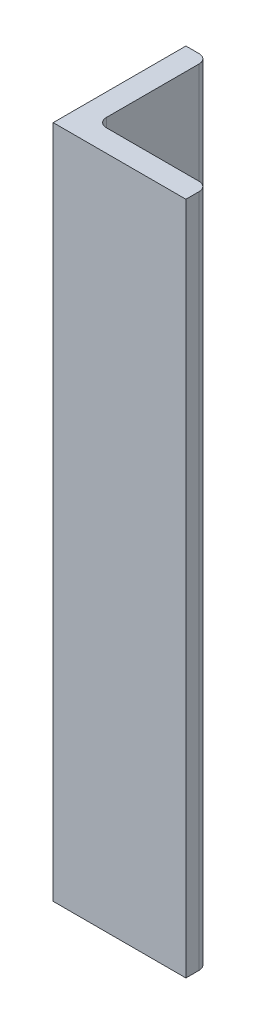
ISO-10303-21;
HEADER;
FILE_DESCRIPTION(('STEP AP214'),'2;1');
FILE_NAME('part.step','',(''),(''),'','','');
FILE_SCHEMA(('AUTOMOTIVE_DESIGN { 1 0 10303 214 1 1 1 1 }'));
ENDSEC;
DATA;
#1=APPLICATION_CONTEXT('core data for automotive mechanical design processes');
#2=APPLICATION_PROTOCOL_DEFINITION('international standard','automotive_design',2000,#1);
#3=PRODUCT_CONTEXT('',#1,'mechanical');
#4=PRODUCT('Part','Part','',(#3));
#5=PRODUCT_RELATED_PRODUCT_CATEGORY('part','',(#4));
#6=PRODUCT_DEFINITION_FORMATION('','',#4);
#7=PRODUCT_DEFINITION_CONTEXT('part definition',#1,'design');
#8=PRODUCT_DEFINITION('design','',#6,#7);
#9=PRODUCT_DEFINITION_SHAPE('','',#8);
#10=(LENGTH_UNIT() NAMED_UNIT(*) SI_UNIT(.MILLI.,.METRE.));
#11=(NAMED_UNIT(*) PLANE_ANGLE_UNIT() SI_UNIT($,.RADIAN.));
#12=(NAMED_UNIT(*) SI_UNIT($,.STERADIAN.) SOLID_ANGLE_UNIT());
#13=UNCERTAINTY_MEASURE_WITH_UNIT(LENGTH_MEASURE(1.E-05),#10,'distance_accuracy_value','');
#14=(GEOMETRIC_REPRESENTATION_CONTEXT(3) GLOBAL_UNCERTAINTY_ASSIGNED_CONTEXT((#13)) GLOBAL_UNIT_ASSIGNED_CONTEXT((#10,
#11,#12)) REPRESENTATION_CONTEXT('',''));
#15=CARTESIAN_POINT('',(0.,0.,0.));
#16=DIRECTION('',(0.,0.,1.));
#17=DIRECTION('',(1.,0.,0.));
#18=AXIS2_PLACEMENT_3D('',#15,#16,#17);
#19=CARTESIAN_POINT('',(19.05,96.8248,0.));
#20=DIRECTION('',(0.,0.,-1.));
#21=DIRECTION('',(-1.,0.,0.));
#22=AXIS2_PLACEMENT_3D('',#19,#20,#21);
#23=PLANE('',#22);
#24=DIRECTION('',(1.,0.,0.));
#25=VECTOR('',#24,1.);
#26=CARTESIAN_POINT('',(19.05,0.,0.));
#27=LINE('',#26,#25);
#28=CARTESIAN_POINT('',(0.,0.,0.));
#29=VERTEX_POINT('',#28);
#30=CARTESIAN_POINT('',(19.05,0.,0.));
#31=VERTEX_POINT('',#30);
#32=EDGE_CURVE('E137',#29,#31,#27,.T.);
#33=ORIENTED_EDGE('',*,*,#32,.T.);
#34=DIRECTION('',(0.,-1.,0.));
#35=VECTOR('',#34,1.);
#36=CARTESIAN_POINT('',(19.05,96.8248,0.));
#37=LINE('',#36,#35);
#38=CARTESIAN_POINT('',(19.05,96.8248,0.));
#39=VERTEX_POINT('',#38);
#40=EDGE_CURVE('E11',#39,#31,#37,.T.);
#41=ORIENTED_EDGE('',*,*,#40,.F.);
#42=DIRECTION('',(1.,0.,0.));
#43=VECTOR('',#42,1.);
#44=CARTESIAN_POINT('',(19.05,96.8248,0.));
#45=LINE('',#44,#43);
#46=CARTESIAN_POINT('',(0.,96.8248,0.));
#47=VERTEX_POINT('',#46);
#48=EDGE_CURVE('E153',#47,#39,#45,.T.);
#49=ORIENTED_EDGE('',*,*,#48,.F.);
#50=DIRECTION('',(0.,-1.,0.));
#51=VECTOR('',#50,1.);
#52=CARTESIAN_POINT('',(0.,96.8248,0.));
#53=LINE('',#52,#51);
#54=EDGE_CURVE('E133',#47,#29,#53,.T.);
#55=ORIENTED_EDGE('',*,*,#54,.T.);
#56=EDGE_LOOP('',(#33,#41,#49,#55));
#57=FACE_BOUND('',#56,.T.);
#58=ADVANCED_FACE('F35',(#57),#23,.F.);
#59=CARTESIAN_POINT('',(19.05,96.8248,-1.905));
#60=DIRECTION('',(-1.,0.,0.));
#61=DIRECTION('',(0.,0.,1.));
#62=AXIS2_PLACEMENT_3D('',#59,#60,#61);
#63=PLANE('',#62);
#64=DIRECTION('',(0.,0.,-1.));
#65=VECTOR('',#64,1.);
#66=CARTESIAN_POINT('',(19.05,0.,-1.905));
#67=LINE('',#66,#65);
#68=CARTESIAN_POINT('',(19.05,0.,-1.905));
#69=VERTEX_POINT('',#68);
#70=EDGE_CURVE('E140',#31,#69,#67,.T.);
#71=ORIENTED_EDGE('',*,*,#70,.T.);
#72=DIRECTION('',(0.,-1.,0.));
#73=VECTOR('',#72,1.);
#74=CARTESIAN_POINT('',(19.05,96.8248,-1.905));
#75=LINE('',#74,#73);
#76=CARTESIAN_POINT('',(19.05,96.8248,-1.905));
#77=VERTEX_POINT('',#76);
#78=EDGE_CURVE('E43',#77,#69,#75,.T.);
#79=ORIENTED_EDGE('',*,*,#78,.F.);
#80=DIRECTION('',(0.,0.,-1.));
#81=VECTOR('',#80,1.);
#82=CARTESIAN_POINT('',(19.05,96.8248,-1.905));
#83=LINE('',#82,#81);
#84=EDGE_CURVE('E97',#39,#77,#83,.T.);
#85=ORIENTED_EDGE('',*,*,#84,.F.);
#86=ORIENTED_EDGE('',*,*,#40,.T.);
#87=EDGE_LOOP('',(#71,#79,#85,#86));
#88=FACE_BOUND('',#87,.T.);
#89=ADVANCED_FACE('F196',(#88),#63,.F.);
#90=CARTESIAN_POINT('',(17.78,96.8248,-1.905));
#91=DIRECTION('',(0.,-1.,0.));
#92=DIRECTION('',(0.,0.,-1.));
#93=AXIS2_PLACEMENT_3D('',#90,#91,#92);
#94=CYLINDRICAL_SURFACE('',#93,1.27);
#95=CARTESIAN_POINT('',(17.78,0.,-1.905));
#96=DIRECTION('',(0.,1.,0.));
#97=DIRECTION('',(0.,0.,-1.));
#98=AXIS2_PLACEMENT_3D('',#95,#96,#97);
#99=CIRCLE('',#98,1.27);
#100=CARTESIAN_POINT('',(17.78,0.,-3.175));
#101=VERTEX_POINT('',#100);
#102=EDGE_CURVE('E142',#69,#101,#99,.T.);
#103=ORIENTED_EDGE('',*,*,#102,.T.);
#104=DIRECTION('',(0.,-1.,0.));
#105=VECTOR('',#104,1.);
#106=CARTESIAN_POINT('',(17.78,96.8248,-3.175));
#107=LINE('',#106,#105);
#108=CARTESIAN_POINT('',(17.78,96.8248,-3.175));
#109=VERTEX_POINT('',#108);
#110=EDGE_CURVE('E163',#109,#101,#107,.T.);
#111=ORIENTED_EDGE('',*,*,#110,.F.);
#112=CARTESIAN_POINT('',(17.78,96.8248,-1.905));
#113=DIRECTION('',(0.,1.,0.));
#114=DIRECTION('',(0.,0.,-1.));
#115=AXIS2_PLACEMENT_3D('',#112,#113,#114);
#116=CIRCLE('',#115,1.27);
#117=EDGE_CURVE('E171',#77,#109,#116,.T.);
#118=ORIENTED_EDGE('',*,*,#117,.F.);
#119=ORIENTED_EDGE('',*,*,#78,.T.);
#120=EDGE_LOOP('',(#103,#111,#118,#119));
#121=FACE_BOUND('',#120,.T.);
#122=ADVANCED_FACE('F169',(#121),#94,.T.);
#123=CARTESIAN_POINT('',(4.445,96.8248,-3.175));
#124=DIRECTION('',(0.,0.,1.));
#125=DIRECTION('',(1.,0.,0.));
#126=AXIS2_PLACEMENT_3D('',#123,#124,#125);
#127=PLANE('',#126);
#128=DIRECTION('',(-1.,0.,0.));
#129=VECTOR('',#128,1.);
#130=CARTESIAN_POINT('',(4.445,0.,-3.175));
#131=LINE('',#130,#129);
#132=CARTESIAN_POINT('',(4.445,0.,-3.175));
#133=VERTEX_POINT('',#132);
#134=EDGE_CURVE('E144',#101,#133,#131,.T.);
#135=ORIENTED_EDGE('',*,*,#134,.T.);
#136=DIRECTION('',(0.,-1.,0.));
#137=VECTOR('',#136,1.);
#138=CARTESIAN_POINT('',(4.445,96.8248,-3.175));
#139=LINE('',#138,#137);
#140=CARTESIAN_POINT('',(4.445,96.8248,-3.175));
#141=VERTEX_POINT('',#140);
#142=EDGE_CURVE('E160',#141,#133,#139,.T.);
#143=ORIENTED_EDGE('',*,*,#142,.F.);
#144=DIRECTION('',(-1.,0.,0.));
#145=VECTOR('',#144,1.);
#146=CARTESIAN_POINT('',(4.445,96.8248,-3.175));
#147=LINE('',#146,#145);
#148=EDGE_CURVE('E187',#109,#141,#147,.T.);
#149=ORIENTED_EDGE('',*,*,#148,.F.);
#150=ORIENTED_EDGE('',*,*,#110,.T.);
#151=EDGE_LOOP('',(#135,#143,#149,#150));
#152=FACE_BOUND('',#151,.T.);
#153=ADVANCED_FACE('F180',(#152),#127,.F.);
#154=CARTESIAN_POINT('',(4.445,96.8248,-4.445));
#155=DIRECTION('',(0.,-1.,0.));
#156=DIRECTION('',(0.,0.,-1.));
#157=AXIS2_PLACEMENT_3D('',#154,#155,#156);
#158=CYLINDRICAL_SURFACE('',#157,1.27);
#159=CARTESIAN_POINT('',(4.445,0.,-4.445));
#160=DIRECTION('',(0.,-1.,0.));
#161=DIRECTION('',(0.,0.,1.));
#162=AXIS2_PLACEMENT_3D('',#159,#160,#161);
#163=CIRCLE('',#162,1.27);
#164=CARTESIAN_POINT('',(3.175,0.,-4.445));
#165=VERTEX_POINT('',#164);
#166=EDGE_CURVE('E146',#133,#165,#163,.T.);
#167=ORIENTED_EDGE('',*,*,#166,.T.);
#168=DIRECTION('',(0.,-1.,0.));
#169=VECTOR('',#168,1.);
#170=CARTESIAN_POINT('',(3.175,96.8248,-4.445));
#171=LINE('',#170,#169);
#172=CARTESIAN_POINT('',(3.175,96.8248,-4.445));
#173=VERTEX_POINT('',#172);
#174=EDGE_CURVE('E157',#173,#165,#171,.T.);
#175=ORIENTED_EDGE('',*,*,#174,.F.);
#176=CARTESIAN_POINT('',(4.445,96.8248,-4.445));
#177=DIRECTION('',(0.,-1.,0.));
#178=DIRECTION('',(0.,0.,1.));
#179=AXIS2_PLACEMENT_3D('',#176,#177,#178);
#180=CIRCLE('',#179,1.27);
#181=EDGE_CURVE('E186',#141,#173,#180,.T.);
#182=ORIENTED_EDGE('',*,*,#181,.F.);
#183=ORIENTED_EDGE('',*,*,#142,.T.);
#184=EDGE_LOOP('',(#167,#175,#182,#183));
#185=FACE_BOUND('',#184,.T.);
#186=ADVANCED_FACE('F184',(#185),#158,.F.);
#187=CARTESIAN_POINT('',(3.175,96.8248,-17.78));
#188=DIRECTION('',(-1.,0.,0.));
#189=DIRECTION('',(0.,0.,1.));
#190=AXIS2_PLACEMENT_3D('',#187,#188,#189);
#191=PLANE('',#190);
#192=DIRECTION('',(0.,0.,-1.));
#193=VECTOR('',#192,1.);
#194=CARTESIAN_POINT('',(3.175,0.,-17.78));
#195=LINE('',#194,#193);
#196=CARTESIAN_POINT('',(3.175,0.,-17.78));
#197=VERTEX_POINT('',#196);
#198=EDGE_CURVE('E148',#165,#197,#195,.T.);
#199=ORIENTED_EDGE('',*,*,#198,.T.);
#200=DIRECTION('',(0.,-1.,0.));
#201=VECTOR('',#200,1.);
#202=CARTESIAN_POINT('',(3.175,96.8248,-17.78));
#203=LINE('',#202,#201);
#204=CARTESIAN_POINT('',(3.175,96.8248,-17.78));
#205=VERTEX_POINT('',#204);
#206=EDGE_CURVE('E128',#205,#197,#203,.T.);
#207=ORIENTED_EDGE('',*,*,#206,.F.);
#208=DIRECTION('',(0.,0.,-1.));
#209=VECTOR('',#208,1.);
#210=CARTESIAN_POINT('',(3.175,96.8248,-17.78));
#211=LINE('',#210,#209);
#212=EDGE_CURVE('E119',#173,#205,#211,.T.);
#213=ORIENTED_EDGE('',*,*,#212,.F.);
#214=ORIENTED_EDGE('',*,*,#174,.T.);
#215=EDGE_LOOP('',(#199,#207,#213,#214));
#216=FACE_BOUND('',#215,.T.);
#217=ADVANCED_FACE('F208',(#216),#191,.F.);
#218=CARTESIAN_POINT('',(1.905,96.8248,-17.78));
#219=DIRECTION('',(0.,-1.,0.));
#220=DIRECTION('',(0.,0.,-1.));
#221=AXIS2_PLACEMENT_3D('',#218,#219,#220);
#222=CYLINDRICAL_SURFACE('',#221,1.27);
#223=CARTESIAN_POINT('',(1.905,0.,-17.78));
#224=DIRECTION('',(0.,1.,0.));
#225=DIRECTION('',(0.,0.,-1.));
#226=AXIS2_PLACEMENT_3D('',#223,#224,#225);
#227=CIRCLE('',#226,1.27);
#228=CARTESIAN_POINT('',(1.90499999999999,0.,-19.05));
#229=VERTEX_POINT('',#228);
#230=EDGE_CURVE('E127',#197,#229,#227,.T.);
#231=ORIENTED_EDGE('',*,*,#230,.T.);
#232=DIRECTION('',(0.,-1.,0.));
#233=VECTOR('',#232,1.);
#234=CARTESIAN_POINT('',(1.90499999999999,96.8248,-19.05));
#235=LINE('',#234,#233);
#236=CARTESIAN_POINT('',(1.90499999999999,96.8248,-19.05));
#237=VERTEX_POINT('',#236);
#238=EDGE_CURVE('E124',#237,#229,#235,.T.);
#239=ORIENTED_EDGE('',*,*,#238,.F.);
#240=CARTESIAN_POINT('',(1.905,96.8248,-17.78));
#241=DIRECTION('',(0.,1.,0.));
#242=DIRECTION('',(0.,0.,-1.));
#243=AXIS2_PLACEMENT_3D('',#240,#241,#242);
#244=CIRCLE('',#243,1.27);
#245=EDGE_CURVE('E113',#205,#237,#244,.T.);
#246=ORIENTED_EDGE('',*,*,#245,.F.);
#247=ORIENTED_EDGE('',*,*,#206,.T.);
#248=EDGE_LOOP('',(#231,#239,#246,#247));
#249=FACE_BOUND('',#248,.T.);
#250=ADVANCED_FACE('F125',(#249),#222,.T.);
#251=CARTESIAN_POINT('',(0.,96.8248,-19.05));
#252=DIRECTION('',(0.,0.,1.));
#253=DIRECTION('',(1.,0.,0.));
#254=AXIS2_PLACEMENT_3D('',#251,#252,#253);
#255=PLANE('',#254);
#256=DIRECTION('',(-1.,0.,0.));
#257=VECTOR('',#256,1.);
#258=CARTESIAN_POINT('',(0.,0.,-19.05));
#259=LINE('',#258,#257);
#260=CARTESIAN_POINT('',(0.,0.,-19.05));
#261=VERTEX_POINT('',#260);
#262=EDGE_CURVE('E83',#229,#261,#259,.T.);
#263=ORIENTED_EDGE('',*,*,#262,.T.);
#264=DIRECTION('',(0.,-1.,0.));
#265=VECTOR('',#264,1.);
#266=CARTESIAN_POINT('',(0.,96.8248,-19.05));
#267=LINE('',#266,#265);
#268=CARTESIAN_POINT('',(0.,96.8248,-19.05));
#269=VERTEX_POINT('',#268);
#270=EDGE_CURVE('E129',#269,#261,#267,.T.);
#271=ORIENTED_EDGE('',*,*,#270,.F.);
#272=DIRECTION('',(-1.,0.,0.));
#273=VECTOR('',#272,1.);
#274=CARTESIAN_POINT('',(0.,96.8248,-19.05));
#275=LINE('',#274,#273);
#276=EDGE_CURVE('E117',#237,#269,#275,.T.);
#277=ORIENTED_EDGE('',*,*,#276,.F.);
#278=ORIENTED_EDGE('',*,*,#238,.T.);
#279=EDGE_LOOP('',(#263,#271,#277,#278));
#280=FACE_BOUND('',#279,.T.);
#281=ADVANCED_FACE('F131',(#280),#255,.F.);
#282=CARTESIAN_POINT('',(0.,96.8248,0.));
#283=DIRECTION('',(1.,0.,0.));
#284=DIRECTION('',(0.,0.,-1.));
#285=AXIS2_PLACEMENT_3D('',#282,#283,#284);
#286=PLANE('',#285);
#287=DIRECTION('',(0.,0.,1.));
#288=VECTOR('',#287,1.);
#289=CARTESIAN_POINT('',(0.,0.,0.));
#290=LINE('',#289,#288);
#291=EDGE_CURVE('E89',#261,#29,#290,.T.);
#292=ORIENTED_EDGE('',*,*,#291,.T.);
#293=ORIENTED_EDGE('',*,*,#54,.F.);
#294=DIRECTION('',(0.,0.,1.));
#295=VECTOR('',#294,1.);
#296=CARTESIAN_POINT('',(0.,96.8248,0.));
#297=LINE('',#296,#295);
#298=EDGE_CURVE('E51',#269,#47,#297,.T.);
#299=ORIENTED_EDGE('',*,*,#298,.F.);
#300=ORIENTED_EDGE('',*,*,#270,.T.);
#301=EDGE_LOOP('',(#292,#293,#299,#300));
#302=FACE_BOUND('',#301,.T.);
#303=ADVANCED_FACE('F216',(#302),#286,.F.);
#304=CARTESIAN_POINT('',(1.905,96.8248,-17.78));
#305=DIRECTION('',(0.,-1.,0.));
#306=DIRECTION('',(0.,0.,-1.));
#307=AXIS2_PLACEMENT_3D('',#304,#305,#306);
#308=PLANE('',#307);
#309=ORIENTED_EDGE('',*,*,#48,.T.);
#310=ORIENTED_EDGE('',*,*,#84,.T.);
#311=ORIENTED_EDGE('',*,*,#117,.T.);
#312=ORIENTED_EDGE('',*,*,#148,.T.);
#313=ORIENTED_EDGE('',*,*,#181,.T.);
#314=ORIENTED_EDGE('',*,*,#212,.T.);
#315=ORIENTED_EDGE('',*,*,#245,.T.);
#316=ORIENTED_EDGE('',*,*,#276,.T.);
#317=ORIENTED_EDGE('',*,*,#298,.T.);
#318=EDGE_LOOP('',(#309,#310,#311,#312,#313,#314,#315,#316,#317));
#319=FACE_BOUND('',#318,.T.);
#320=ADVANCED_FACE('F115',(#319),#308,.F.);
#321=CARTESIAN_POINT('',(1.905,0.,-17.78));
#322=DIRECTION('',(0.,-1.,0.));
#323=DIRECTION('',(0.,0.,-1.));
#324=AXIS2_PLACEMENT_3D('',#321,#322,#323);
#325=PLANE('',#324);
#326=ORIENTED_EDGE('',*,*,#32,.F.);
#327=ORIENTED_EDGE('',*,*,#291,.F.);
#328=ORIENTED_EDGE('',*,*,#262,.F.);
#329=ORIENTED_EDGE('',*,*,#230,.F.);
#330=ORIENTED_EDGE('',*,*,#198,.F.);
#331=ORIENTED_EDGE('',*,*,#166,.F.);
#332=ORIENTED_EDGE('',*,*,#134,.F.);
#333=ORIENTED_EDGE('',*,*,#102,.F.);
#334=ORIENTED_EDGE('',*,*,#70,.F.);
#335=EDGE_LOOP('',(#326,#327,#328,#329,#330,#331,#332,#333,#334));
#336=FACE_BOUND('',#335,.T.);
#337=ADVANCED_FACE('F175',(#336),#325,.T.);
#338=CLOSED_SHELL('',(#58,#89,#122,#153,#186,#217,#250,#281,#303,#320,#337));
#339=MANIFOLD_SOLID_BREP('B2',#338);
#340=ADVANCED_BREP_SHAPE_REPRESENTATION('',(#18,#339),#14);
#341=SHAPE_DEFINITION_REPRESENTATION(#9,#340);
ENDSEC;
END-ISO-10303-21;
